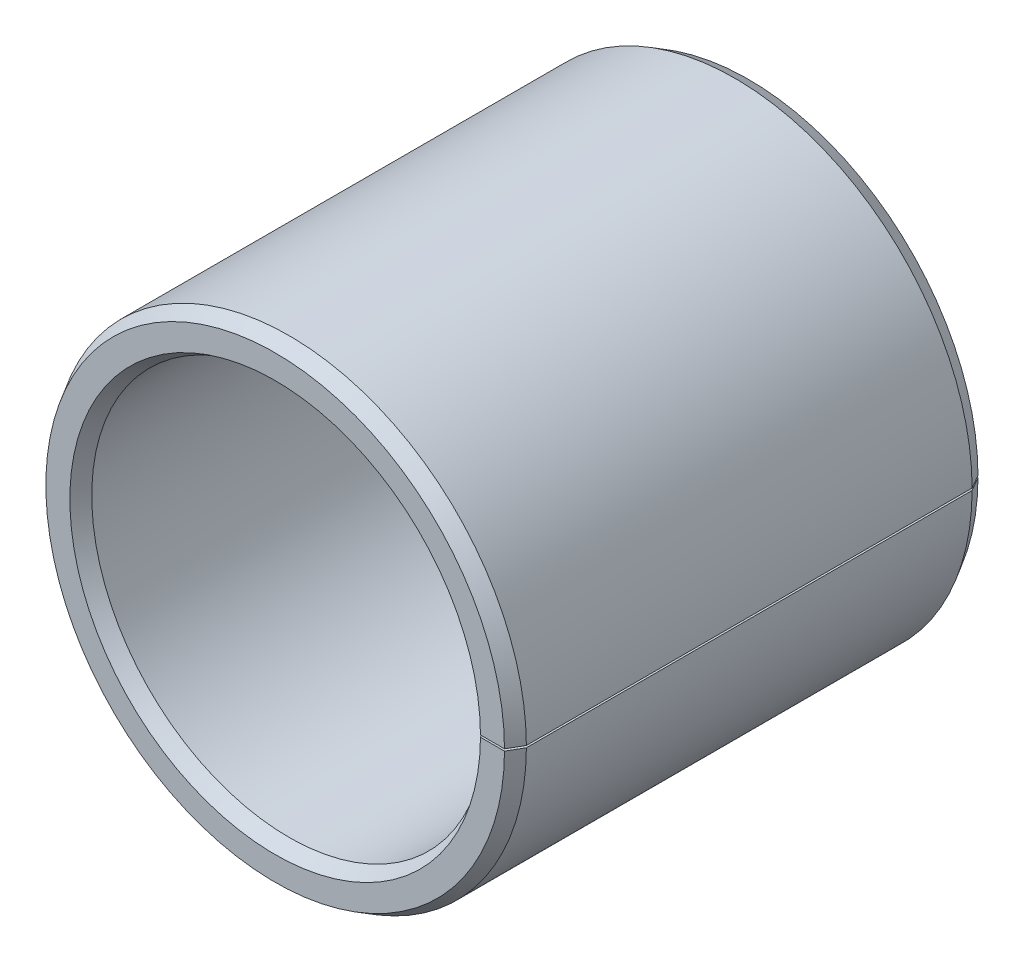
ISO-10303-21;
HEADER;
FILE_DESCRIPTION(('STEP AP214'),'2;1');
FILE_NAME('part.step','',(''),(''),'','','');
FILE_SCHEMA(('AUTOMOTIVE_DESIGN { 1 0 10303 214 1 1 1 1 }'));
ENDSEC;
DATA;
#1=APPLICATION_CONTEXT('core data for automotive mechanical design processes');
#2=APPLICATION_PROTOCOL_DEFINITION('international standard','automotive_design',2000,#1);
#3=PRODUCT_CONTEXT('',#1,'mechanical');
#4=PRODUCT('Part','Part','',(#3));
#5=PRODUCT_RELATED_PRODUCT_CATEGORY('part','',(#4));
#6=PRODUCT_DEFINITION_FORMATION('','',#4);
#7=PRODUCT_DEFINITION_CONTEXT('part definition',#1,'design');
#8=PRODUCT_DEFINITION('design','',#6,#7);
#9=PRODUCT_DEFINITION_SHAPE('','',#8);
#10=(LENGTH_UNIT() NAMED_UNIT(*) SI_UNIT(.MILLI.,.METRE.));
#11=(NAMED_UNIT(*) PLANE_ANGLE_UNIT() SI_UNIT($,.RADIAN.));
#12=(NAMED_UNIT(*) SI_UNIT($,.STERADIAN.) SOLID_ANGLE_UNIT());
#13=UNCERTAINTY_MEASURE_WITH_UNIT(LENGTH_MEASURE(1.E-05),#10,'distance_accuracy_value','');
#14=(GEOMETRIC_REPRESENTATION_CONTEXT(3) GLOBAL_UNCERTAINTY_ASSIGNED_CONTEXT((#13)) GLOBAL_UNIT_ASSIGNED_CONTEXT((#10,
#11,#12)) REPRESENTATION_CONTEXT('',''));
#15=CARTESIAN_POINT('',(0.,0.,0.));
#16=DIRECTION('',(0.,0.,1.));
#17=DIRECTION('',(1.,0.,0.));
#18=AXIS2_PLACEMENT_3D('',#15,#16,#17);
#19=CARTESIAN_POINT('',(0.,0.,5.64839368606353));
#20=DIRECTION('',(0.,0.,1.));
#21=DIRECTION('',(1.,0.,0.));
#22=AXIS2_PLACEMENT_3D('',#19,#20,#21);
#23=PLANE('',#22);
#24=DIRECTION('',(-1.,0.,0.));
#25=VECTOR('',#24,1.);
#26=CARTESIAN_POINT('',(0.,0.025,5.64839368606353));
#27=LINE('',#26,#25);
#28=CARTESIAN_POINT('',(5.20293993815036,0.025,5.64839368606353));
#29=VERTEX_POINT('',#28);
#30=CARTESIAN_POINT('',(4.99993749960938,0.025,5.64839368606353));
#31=VERTEX_POINT('',#30);
#32=EDGE_CURVE('E105',#29,#31,#27,.T.);
#33=ORIENTED_EDGE('',*,*,#32,.F.);
#34=CARTESIAN_POINT('',(0.,0.,5.64839368606353));
#35=DIRECTION('',(0.,0.,1.));
#36=DIRECTION('',(1.,0.,0.));
#37=AXIS2_PLACEMENT_3D('',#34,#35,#36);
#38=CIRCLE('',#37,5.20300000000001);
#39=CARTESIAN_POINT('',(5.20293993815036,-0.025,5.64839368606353));
#40=VERTEX_POINT('',#39);
#41=EDGE_CURVE('E94',#29,#40,#38,.T.);
#42=ORIENTED_EDGE('',*,*,#41,.T.);
#43=DIRECTION('',(1.,0.,0.));
#44=VECTOR('',#43,1.);
#45=CARTESIAN_POINT('',(0.,-0.025,5.64839368606353));
#46=LINE('',#45,#44);
#47=CARTESIAN_POINT('',(4.99993749960938,-0.025,5.64839368606353));
#48=VERTEX_POINT('',#47);
#49=EDGE_CURVE('E117',#48,#40,#46,.T.);
#50=ORIENTED_EDGE('',*,*,#49,.F.);
#51=CARTESIAN_POINT('',(0.,0.,5.64839368606353));
#52=DIRECTION('',(0.,0.,1.));
#53=DIRECTION('',(1.,0.,0.));
#54=AXIS2_PLACEMENT_3D('',#51,#52,#53);
#55=CIRCLE('',#54,5.00000000000001);
#56=EDGE_CURVE('E101',#31,#48,#55,.T.);
#57=ORIENTED_EDGE('',*,*,#56,.F.);
#58=EDGE_LOOP('',(#33,#42,#50,#57));
#59=FACE_BOUND('',#58,.T.);
#60=ADVANCED_FACE('F49',(#59),#23,.T.);
#61=CARTESIAN_POINT('',(0.,0.,5.64839368606353));
#62=DIRECTION('',(0.,0.,-1.));
#63=DIRECTION('',(-1.,0.,0.));
#64=AXIS2_PLACEMENT_3D('',#61,#62,#63);
#65=CYLINDRICAL_SURFACE('',#64,5.20300000000001);
#66=ORIENTED_EDGE('',*,*,#41,.F.);
#67=DIRECTION('',(0.,0.,-1.));
#68=VECTOR('',#67,1.);
#69=CARTESIAN_POINT('',(5.20293993815036,0.025,5.64839368606353));
#70=LINE('',#69,#68);
#71=CARTESIAN_POINT('',(5.20293993815036,0.025,-5.64839368606352));
#72=VERTEX_POINT('',#71);
#73=EDGE_CURVE('E108',#29,#72,#70,.T.);
#74=ORIENTED_EDGE('',*,*,#73,.T.);
#75=CARTESIAN_POINT('',(0.,0.,-5.64839368606352));
#76=DIRECTION('',(0.,0.,1.));
#77=DIRECTION('',(1.,0.,0.));
#78=AXIS2_PLACEMENT_3D('',#75,#76,#77);
#79=CIRCLE('',#78,5.20300000000001);
#80=CARTESIAN_POINT('',(5.20293993815036,-0.025,-5.64839368606352));
#81=VERTEX_POINT('',#80);
#82=EDGE_CURVE('E104',#72,#81,#79,.T.);
#83=ORIENTED_EDGE('',*,*,#82,.T.);
#84=DIRECTION('',(0.,0.,-1.));
#85=VECTOR('',#84,1.);
#86=CARTESIAN_POINT('',(5.20293993815036,-0.025,5.64839368606353));
#87=LINE('',#86,#85);
#88=EDGE_CURVE('E64',#81,#40,#87,.F.);
#89=ORIENTED_EDGE('',*,*,#88,.T.);
#90=EDGE_LOOP('',(#66,#74,#83,#89));
#91=FACE_BOUND('',#90,.T.);
#92=ADVANCED_FACE('F51',(#91),#65,.T.);
#93=CARTESIAN_POINT('',(0.,0.,5.64839368606353));
#94=DIRECTION('',(0.,0.,-1.));
#95=DIRECTION('',(-1.,0.,0.));
#96=AXIS2_PLACEMENT_3D('',#93,#94,#95);
#97=CYLINDRICAL_SURFACE('',#96,5.00000000000001);
#98=DIRECTION('',(0.,0.,-1.));
#99=VECTOR('',#98,1.);
#100=CARTESIAN_POINT('',(4.99993749960938,0.025,5.64839368606353));
#101=LINE('',#100,#99);
#102=CARTESIAN_POINT('',(4.99993749960938,0.025,-5.64839368606352));
#103=VERTEX_POINT('',#102);
#104=EDGE_CURVE('E72',#31,#103,#101,.T.);
#105=ORIENTED_EDGE('',*,*,#104,.F.);
#106=ORIENTED_EDGE('',*,*,#56,.T.);
#107=DIRECTION('',(0.,0.,-1.));
#108=VECTOR('',#107,1.);
#109=CARTESIAN_POINT('',(4.99993749960938,-0.025,5.64839368606353));
#110=LINE('',#109,#108);
#111=CARTESIAN_POINT('',(4.99993749960938,-0.025,-5.64839368606352));
#112=VERTEX_POINT('',#111);
#113=EDGE_CURVE('E88',#112,#48,#110,.F.);
#114=ORIENTED_EDGE('',*,*,#113,.F.);
#115=CARTESIAN_POINT('',(0.,0.,-5.64839368606352));
#116=DIRECTION('',(0.,0.,1.));
#117=DIRECTION('',(1.,0.,0.));
#118=AXIS2_PLACEMENT_3D('',#115,#116,#117);
#119=CIRCLE('',#118,5.00000000000001);
#120=EDGE_CURVE('E99',#103,#112,#119,.T.);
#121=ORIENTED_EDGE('',*,*,#120,.F.);
#122=EDGE_LOOP('',(#105,#106,#114,#121));
#123=FACE_BOUND('',#122,.T.);
#124=ADVANCED_FACE('F98',(#123),#97,.F.);
#125=CARTESIAN_POINT('',(0.,0.,-5.64839368606352));
#126=DIRECTION('',(0.,0.,1.));
#127=DIRECTION('',(1.,0.,0.));
#128=AXIS2_PLACEMENT_3D('',#125,#126,#127);
#129=PLANE('',#128);
#130=ORIENTED_EDGE('',*,*,#82,.F.);
#131=DIRECTION('',(-1.,0.,0.));
#132=VECTOR('',#131,1.);
#133=CARTESIAN_POINT('',(0.,0.025,-5.64839368606352));
#134=LINE('',#133,#132);
#135=EDGE_CURVE('E12',#72,#103,#134,.T.);
#136=ORIENTED_EDGE('',*,*,#135,.T.);
#137=ORIENTED_EDGE('',*,*,#120,.T.);
#138=DIRECTION('',(1.,0.,0.));
#139=VECTOR('',#138,1.);
#140=CARTESIAN_POINT('',(0.,-0.025,-5.64839368606352));
#141=LINE('',#140,#139);
#142=EDGE_CURVE('E57',#112,#81,#141,.T.);
#143=ORIENTED_EDGE('',*,*,#142,.T.);
#144=EDGE_LOOP('',(#130,#136,#137,#143));
#145=FACE_BOUND('',#144,.T.);
#146=ADVANCED_FACE('F103',(#145),#129,.F.);
#147=CARTESIAN_POINT('',(6.015,-0.025,-6.));
#148=DIRECTION('',(0.,-1.,0.));
#149=DIRECTION('',(0.,0.,-1.));
#150=AXIS2_PLACEMENT_3D('',#147,#148,#149);
#151=PLANE('',#150);
#152=ORIENTED_EDGE('',*,*,#49,.T.);
#153=ORIENTED_EDGE('',*,*,#88,.F.);
#154=ORIENTED_EDGE('',*,*,#142,.F.);
#155=ORIENTED_EDGE('',*,*,#113,.T.);
#156=EDGE_LOOP('',(#152,#153,#154,#155));
#157=FACE_BOUND('',#156,.T.);
#158=ADVANCED_FACE('F87',(#157),#151,.F.);
#159=CARTESIAN_POINT('',(0.,0.025,-6.));
#160=DIRECTION('',(0.,1.,0.));
#161=DIRECTION('',(0.,0.,1.));
#162=AXIS2_PLACEMENT_3D('',#159,#160,#161);
#163=PLANE('',#162);
#164=ORIENTED_EDGE('',*,*,#32,.T.);
#165=ORIENTED_EDGE('',*,*,#104,.T.);
#166=ORIENTED_EDGE('',*,*,#135,.F.);
#167=ORIENTED_EDGE('',*,*,#73,.F.);
#168=EDGE_LOOP('',(#164,#165,#166,#167));
#169=FACE_BOUND('',#168,.T.);
#170=ADVANCED_FACE('F123',(#169),#163,.F.);
#171=CLOSED_SHELL('',(#60,#92,#124,#146,#158,#170));
#172=MANIFOLD_SOLID_BREP('B2',#171);
#173=CARTESIAN_POINT('',(0.,0.,6.));
#174=DIRECTION('',(0.,0.,1.));
#175=DIRECTION('',(0.,-1.,0.));
#176=AXIS2_PLACEMENT_3D('',#173,#174,#175);
#177=CYLINDRICAL_SURFACE('',#176,6.015);
#178=CARTESIAN_POINT('',(0.,0.,5.64839368606353));
#179=DIRECTION('',(0.,0.,-1.));
#180=DIRECTION('',(0.,1.,0.));
#181=AXIS2_PLACEMENT_3D('',#178,#179,#180);
#182=CIRCLE('',#181,6.015);
#183=CARTESIAN_POINT('',(6.01494804632592,-0.025,5.64839368606353));
#184=VERTEX_POINT('',#183);
#185=CARTESIAN_POINT('',(6.01494804632592,0.025,5.64839368606353));
#186=VERTEX_POINT('',#185);
#187=EDGE_CURVE('E275',#184,#186,#182,.T.);
#188=ORIENTED_EDGE('',*,*,#187,.T.);
#189=DIRECTION('',(0.,0.,1.));
#190=VECTOR('',#189,1.);
#191=CARTESIAN_POINT('',(6.01494804632592,0.025,6.));
#192=LINE('',#191,#190);
#193=CARTESIAN_POINT('',(6.01494804632592,0.0250000000000021,-5.64839368606352));
#194=VERTEX_POINT('',#193);
#195=EDGE_CURVE('E292',#186,#194,#192,.F.);
#196=ORIENTED_EDGE('',*,*,#195,.T.);
#197=CARTESIAN_POINT('',(0.,0.,-5.64839368606352));
#198=DIRECTION('',(0.,0.,1.));
#199=DIRECTION('',(0.,-1.,0.));
#200=AXIS2_PLACEMENT_3D('',#197,#198,#199);
#201=CIRCLE('',#200,6.015);
#202=CARTESIAN_POINT('',(6.01494804632592,-0.0249999999999979,-5.64839368606352));
#203=VERTEX_POINT('',#202);
#204=EDGE_CURVE('E259',#194,#203,#201,.T.);
#205=ORIENTED_EDGE('',*,*,#204,.T.);
#206=DIRECTION('',(0.,0.,1.));
#207=VECTOR('',#206,1.);
#208=CARTESIAN_POINT('',(6.01494804632592,-0.025,6.));
#209=LINE('',#208,#207);
#210=EDGE_CURVE('E351',#203,#184,#209,.T.);
#211=ORIENTED_EDGE('',*,*,#210,.T.);
#212=EDGE_LOOP('',(#188,#196,#205,#211));
#213=FACE_BOUND('',#212,.T.);
#214=ADVANCED_FACE('F161',(#213),#177,.T.);
#215=CARTESIAN_POINT('',(0.,6.015,6.));
#216=DIRECTION('',(0.,0.,-1.));
#217=DIRECTION('',(0.,1.,0.));
#218=AXIS2_PLACEMENT_3D('',#215,#216,#217);
#219=PLANE('',#218);
#220=CARTESIAN_POINT('',(0.,0.,6.));
#221=DIRECTION('',(0.,0.,-1.));
#222=DIRECTION('',(0.,1.,0.));
#223=AXIS2_PLACEMENT_3D('',#220,#221,#222);
#224=CIRCLE('',#223,5.20300000000001);
#225=CARTESIAN_POINT('',(5.20293993815036,-0.025,6.));
#226=VERTEX_POINT('',#225);
#227=CARTESIAN_POINT('',(5.20293993815036,0.025,6.));
#228=VERTEX_POINT('',#227);
#229=EDGE_CURVE('E252',#226,#228,#224,.T.);
#230=ORIENTED_EDGE('',*,*,#229,.T.);
#231=DIRECTION('',(-1.,0.,0.));
#232=VECTOR('',#231,1.);
#233=CARTESIAN_POINT('',(0.,0.025,6.));
#234=LINE('',#233,#232);
#235=CARTESIAN_POINT('',(5.81194623168522,0.025,6.));
#236=VERTEX_POINT('',#235);
#237=EDGE_CURVE('E256',#236,#228,#234,.T.);
#238=ORIENTED_EDGE('',*,*,#237,.F.);
#239=CARTESIAN_POINT('',(0.,0.,6.));
#240=DIRECTION('',(0.,0.,-1.));
#241=DIRECTION('',(0.,1.,0.));
#242=AXIS2_PLACEMENT_3D('',#239,#240,#241);
#243=CIRCLE('',#242,5.812);
#244=CARTESIAN_POINT('',(5.81194623168522,-0.025,6.));
#245=VERTEX_POINT('',#244);
#246=EDGE_CURVE('E254',#236,#245,#243,.F.);
#247=ORIENTED_EDGE('',*,*,#246,.T.);
#248=DIRECTION('',(1.,0.,0.));
#249=VECTOR('',#248,1.);
#250=CARTESIAN_POINT('',(6.015,-0.025,6.));
#251=LINE('',#250,#249);
#252=EDGE_CURVE('E239',#226,#245,#251,.T.);
#253=ORIENTED_EDGE('',*,*,#252,.F.);
#254=EDGE_LOOP('',(#230,#238,#247,#253));
#255=FACE_BOUND('',#254,.T.);
#256=ADVANCED_FACE('F250',(#255),#219,.F.);
#257=CARTESIAN_POINT('',(0.,5.,-6.));
#258=DIRECTION('',(0.,0.,1.));
#259=DIRECTION('',(0.,-1.,0.));
#260=AXIS2_PLACEMENT_3D('',#257,#258,#259);
#261=PLANE('',#260);
#262=CARTESIAN_POINT('',(0.,0.,-6.));
#263=DIRECTION('',(0.,0.,1.));
#264=DIRECTION('',(0.,-1.,0.));
#265=AXIS2_PLACEMENT_3D('',#262,#263,#264);
#266=CIRCLE('',#265,5.812);
#267=CARTESIAN_POINT('',(5.81194623168522,-0.025,-6.));
#268=VERTEX_POINT('',#267);
#269=CARTESIAN_POINT('',(5.81194623168522,0.025,-6.));
#270=VERTEX_POINT('',#269);
#271=EDGE_CURVE('E263',#268,#270,#266,.F.);
#272=ORIENTED_EDGE('',*,*,#271,.T.);
#273=DIRECTION('',(-1.,0.,0.));
#274=VECTOR('',#273,1.);
#275=CARTESIAN_POINT('',(0.,0.025,-6.));
#276=LINE('',#275,#274);
#277=CARTESIAN_POINT('',(5.20293993815036,0.025,-6.));
#278=VERTEX_POINT('',#277);
#279=EDGE_CURVE('E255',#270,#278,#276,.T.);
#280=ORIENTED_EDGE('',*,*,#279,.T.);
#281=CARTESIAN_POINT('',(0.,0.,-6.));
#282=DIRECTION('',(0.,0.,1.));
#283=DIRECTION('',(0.,-1.,0.));
#284=AXIS2_PLACEMENT_3D('',#281,#282,#283);
#285=CIRCLE('',#284,5.203);
#286=CARTESIAN_POINT('',(5.20293993815036,-0.025,-6.));
#287=VERTEX_POINT('',#286);
#288=EDGE_CURVE('E271',#278,#287,#285,.T.);
#289=ORIENTED_EDGE('',*,*,#288,.T.);
#290=DIRECTION('',(1.,0.,0.));
#291=VECTOR('',#290,1.);
#292=CARTESIAN_POINT('',(6.015,-0.025,-6.));
#293=LINE('',#292,#291);
#294=EDGE_CURVE('E390',#287,#268,#293,.T.);
#295=ORIENTED_EDGE('',*,*,#294,.T.);
#296=EDGE_LOOP('',(#272,#280,#289,#295));
#297=FACE_BOUND('',#296,.T.);
#298=ADVANCED_FACE('F361',(#297),#261,.F.);
#299=CARTESIAN_POINT('',(0.,0.,5.64839368606351));
#300=DIRECTION('',(0.,0.,1.));
#301=DIRECTION('',(0.,-1.,0.));
#302=AXIS2_PLACEMENT_3D('',#299,#300,#301);
#303=CONICAL_SURFACE('',#302,5.,0.523598775598299);
#304=CARTESIAN_POINT('',(8.27378166634671,0.025,11.3188152843196));
#305=CARTESIAN_POINT('',(7.17061119781088,0.025,9.40805344412511));
#306=CARTESIAN_POINT('',(6.06742813863086,0.025,7.49729887330834));
#307=CARTESIAN_POINT('',(3.86103683891854,0.025,3.67580427031968));
#308=CARTESIAN_POINT('',(2.75782859838625,0.025,1.76506423814778));
#309=CARTESIAN_POINT('',(1.65460776720976,0.025,-0.14566852464637));
#310=B_SPLINE_CURVE_WITH_KNOTS('',3,(#304,#305,#306,#307,#308,#309),.UNSPECIFIED.,.F.,.F.,(4,2,
4),(0.,6.61906058497961,13.2381211703424),.UNSPECIFIED.);
#311=CARTESIAN_POINT('',(4.99993749960938,0.025,5.64839368606353));
#312=VERTEX_POINT('',#311);
#313=EDGE_CURVE('E185',#228,#312,#310,.T.);
#314=ORIENTED_EDGE('',*,*,#313,.F.);
#315=ORIENTED_EDGE('',*,*,#229,.F.);
#316=CARTESIAN_POINT('',(1.65460776720976,-0.025,-0.14566852464637));
#317=CARTESIAN_POINT('',(2.02236511237594,-0.025,0.491248695610512));
#318=CARTESIAN_POINT('',(2.39011602194577,-0.025,1.12816963164013));
#319=CARTESIAN_POINT('',(3.49333349520232,-0.025,3.03890433306759));
#320=CARTESIAN_POINT('',(4.22878578986687,-0.025,4.31272633707269));
#321=CARTESIAN_POINT('',(6.06741302942579,-0.025,7.49730759702126));
#322=CARTESIAN_POINT('',(7.1705809794247,-0.025,9.40807089159242));
#323=CARTESIAN_POINT('',(8.27378166634671,-0.025,11.3188152843196));
#324=B_SPLINE_CURVE_WITH_KNOTS('',3,(#316,#317,#318,#319,#320,#321,#322,#323),.UNSPECIFIED.,.F.,
.F.,(4,2,2,4),(0.,2.20639549769148,6.61906058565023,13.2381211706298),.UNSPECIFIED.);
#325=CARTESIAN_POINT('',(4.99993749960938,-0.025,5.64839368606353));
#326=VERTEX_POINT('',#325);
#327=EDGE_CURVE('E236',#326,#226,#324,.T.);
#328=ORIENTED_EDGE('',*,*,#327,.F.);
#329=CARTESIAN_POINT('',(0.,0.,5.64839368606353));
#330=DIRECTION('',(0.,0.,1.));
#331=DIRECTION('',(1.,0.,0.));
#332=AXIS2_PLACEMENT_3D('',#329,#330,#331);
#333=CIRCLE('',#332,5.00000000000001);
#334=EDGE_CURVE('E260',#312,#326,#333,.T.);
#335=ORIENTED_EDGE('',*,*,#334,.F.);
#336=EDGE_LOOP('',(#314,#315,#328,#335));
#337=FACE_BOUND('',#336,.T.);
#338=ADVANCED_FACE('F258',(#337),#303,.F.);
#339=CARTESIAN_POINT('',(0.,0.,-5.64839368606352));
#340=DIRECTION('',(0.,0.,1.));
#341=DIRECTION('',(0.,-1.,0.));
#342=AXIS2_PLACEMENT_3D('',#339,#340,#341);
#343=CONICAL_SURFACE('',#342,6.015,0.523598775598299);
#344=CARTESIAN_POINT('',(1.91683696936093,0.025,-12.7463379103397));
#345=CARTESIAN_POINT('',(2.34285834223249,0.025,-12.008496610589));
#346=CARTESIAN_POINT('',(2.76887415994896,0.025,-11.2706521034525));
#347=CARTESIAN_POINT('',(4.04689118078146,0.025,-9.05714284406147));
#348=CARTESIAN_POINT('',(4.89888006672524,0.025,-7.58147098023761));
#349=CARTESIAN_POINT('',(7.02884926280297,0.025,-3.89226866160568));
#350=CARTESIAN_POINT('',(8.30682353492939,0.025,-1.67873472067326));
#351=CARTESIAN_POINT('',(9.58482606545364,0.025,0.534782904511334));
#352=B_SPLINE_CURVE_WITH_KNOTS('',3,(#344,#345,#346,#347,#348,#349,#350,#351),.UNSPECIFIED.,.F.,
.F.,(4,2,2,4),(0.,2.55599998883889,7.66789128282732,15.3357825652233),.UNSPECIFIED.);
#353=EDGE_CURVE('E289',#270,#194,#352,.T.);
#354=ORIENTED_EDGE('',*,*,#353,.F.);
#355=ORIENTED_EDGE('',*,*,#271,.F.);
#356=CARTESIAN_POINT('',(9.58482606545364,-0.025,0.534782904511334));
#357=CARTESIAN_POINT('',(8.30684961940359,-0.025,-1.67874978111357));
#358=CARTESIAN_POINT('',(7.02886230504778,-0.025,-3.89227619181249));
#359=CARTESIAN_POINT('',(4.47286593968354,-0.025,-8.31931646342952));
#360=CARTESIAN_POINT('',(3.19485688867512,-0.025,-10.5328303243476));
#361=CARTESIAN_POINT('',(1.91683696936093,-0.025,-12.7463379103397));
#362=B_SPLINE_CURVE_WITH_KNOTS('',3,(#356,#357,#358,#359,#360,#361),.UNSPECIFIED.,.F.,.F.,(4,2,
4),(0.,7.66789128239598,15.3357825650384),.UNSPECIFIED.);
#363=EDGE_CURVE('E345',#203,#268,#362,.T.);
#364=ORIENTED_EDGE('',*,*,#363,.F.);
#365=ORIENTED_EDGE('',*,*,#204,.F.);
#366=EDGE_LOOP('',(#354,#355,#364,#365));
#367=FACE_BOUND('',#366,.T.);
#368=ADVANCED_FACE('F353',(#367),#343,.T.);
#369=CARTESIAN_POINT('',(0.,0.,-6.));
#370=DIRECTION('',(0.,0.,-1.));
#371=DIRECTION('',(0.,1.,0.));
#372=AXIS2_PLACEMENT_3D('',#369,#370,#371);
#373=CONICAL_SURFACE('',#372,5.203,0.523598775598299);
#374=CARTESIAN_POINT('',(1.65460776720976,0.025,0.145668524646367));
#375=CARTESIAN_POINT('',(2.02236511237594,0.025,-0.491248695610515));
#376=CARTESIAN_POINT('',(2.39011602194577,0.025,-1.12816963164014));
#377=CARTESIAN_POINT('',(3.49333349520232,0.025,-3.0389043330676));
#378=CARTESIAN_POINT('',(4.22878578986686,0.025,-4.3127263370727));
#379=CARTESIAN_POINT('',(6.06741302942579,0.025,-7.49730759702126));
#380=CARTESIAN_POINT('',(7.17058097942469,0.025,-9.40807089159242));
#381=CARTESIAN_POINT('',(8.2737816663467,0.025,-11.3188152843196));
#382=B_SPLINE_CURVE_WITH_KNOTS('',3,(#374,#375,#376,#377,#378,#379,#380,#381),.UNSPECIFIED.,.F.,
.F.,(4,2,2,4),(0.,2.20639549769148,6.61906058565023,13.2381211706298),.UNSPECIFIED.);
#383=CARTESIAN_POINT('',(4.99993749960937,0.025,-5.64839368606352));
#384=VERTEX_POINT('',#383);
#385=EDGE_CURVE('E309',#384,#278,#382,.T.);
#386=ORIENTED_EDGE('',*,*,#385,.F.);
#387=CARTESIAN_POINT('',(0.,0.,-5.64839368606352));
#388=DIRECTION('',(0.,0.,1.));
#389=DIRECTION('',(1.,0.,0.));
#390=AXIS2_PLACEMENT_3D('',#387,#388,#389);
#391=CIRCLE('',#390,5.);
#392=CARTESIAN_POINT('',(4.99993749960937,-0.025,-5.64839368606352));
#393=VERTEX_POINT('',#392);
#394=EDGE_CURVE('E265',#384,#393,#391,.T.);
#395=ORIENTED_EDGE('',*,*,#394,.T.);
#396=CARTESIAN_POINT('',(8.2737816663467,-0.025,-11.3188152843196));
#397=CARTESIAN_POINT('',(7.17061119781088,-0.025,-9.40805344412511));
#398=CARTESIAN_POINT('',(6.06742813863085,-0.025,-7.49729887330835));
#399=CARTESIAN_POINT('',(3.86103683891854,-0.025,-3.67580427031968));
#400=CARTESIAN_POINT('',(2.75782859838625,-0.025,-1.76506423814779));
#401=CARTESIAN_POINT('',(1.65460776720976,-0.025,0.145668524646367));
#402=B_SPLINE_CURVE_WITH_KNOTS('',3,(#396,#397,#398,#399,#400,#401),.UNSPECIFIED.,.F.,.F.,(4,2,
4),(0.,6.61906058497961,13.2381211703424),.UNSPECIFIED.);
#403=EDGE_CURVE('E308',#287,#393,#402,.T.);
#404=ORIENTED_EDGE('',*,*,#403,.F.);
#405=ORIENTED_EDGE('',*,*,#288,.F.);
#406=EDGE_LOOP('',(#386,#395,#404,#405));
#407=FACE_BOUND('',#406,.T.);
#408=ADVANCED_FACE('F306',(#407),#373,.F.);
#409=CARTESIAN_POINT('',(0.,0.,6.));
#410=DIRECTION('',(0.,0.,-1.));
#411=DIRECTION('',(0.,1.,0.));
#412=AXIS2_PLACEMENT_3D('',#409,#410,#411);
#413=CONICAL_SURFACE('',#412,5.812,0.523598775598304);
#414=CARTESIAN_POINT('',(9.58482606545366,0.025,-0.534782904511287));
#415=CARTESIAN_POINT('',(8.3068496194036,0.025,1.6787497811136));
#416=CARTESIAN_POINT('',(7.02886230504778,0.025,3.89227619181251));
#417=CARTESIAN_POINT('',(4.47286593968353,0.025,8.31931646342951));
#418=CARTESIAN_POINT('',(3.1948568886751,0.025,10.5328303243476));
#419=CARTESIAN_POINT('',(1.9168369693609,0.025,12.7463379103397));
#420=B_SPLINE_CURVE_WITH_KNOTS('',3,(#414,#415,#416,#417,#418,#419),.UNSPECIFIED.,.F.,.F.,(4,2,
4),(0.,7.66789128239595,15.3357825650384),.UNSPECIFIED.);
#421=EDGE_CURVE('E375',#186,#236,#420,.T.);
#422=ORIENTED_EDGE('',*,*,#421,.F.);
#423=ORIENTED_EDGE('',*,*,#187,.F.);
#424=CARTESIAN_POINT('',(1.9168369693609,-0.025,12.7463379103397));
#425=CARTESIAN_POINT('',(2.34285834223246,-0.025,12.0084966105889));
#426=CARTESIAN_POINT('',(2.76887415994893,-0.025,11.2706521034524));
#427=CARTESIAN_POINT('',(4.04689118078144,-0.025,9.05714284406147));
#428=CARTESIAN_POINT('',(4.89888006672522,-0.025,7.58147098023761));
#429=CARTESIAN_POINT('',(7.02884926280298,-0.025,3.8922686616057));
#430=CARTESIAN_POINT('',(8.3068235349294,-0.025,1.67873472067331));
#431=CARTESIAN_POINT('',(9.58482606545366,-0.025,-0.534782904511287));
#432=B_SPLINE_CURVE_WITH_KNOTS('',3,(#424,#425,#426,#427,#428,#429,#430,#431),.UNSPECIFIED.,.F.,
.F.,(4,2,2,4),(0.,2.55599998883886,7.6678912828273,15.3357825652232),.UNSPECIFIED.);
#433=EDGE_CURVE('E316',#245,#184,#432,.T.);
#434=ORIENTED_EDGE('',*,*,#433,.F.);
#435=ORIENTED_EDGE('',*,*,#246,.F.);
#436=EDGE_LOOP('',(#422,#423,#434,#435));
#437=FACE_BOUND('',#436,.T.);
#438=ADVANCED_FACE('F163',(#437),#413,.T.);
#439=CARTESIAN_POINT('',(0.,0.,-5.64839368606352));
#440=DIRECTION('',(0.,0.,1.));
#441=DIRECTION('',(1.,0.,0.));
#442=AXIS2_PLACEMENT_3D('',#439,#440,#441);
#443=CYLINDRICAL_SURFACE('',#442,5.20300000000001);
#444=CARTESIAN_POINT('',(0.,0.,-5.64839368606352));
#445=DIRECTION('',(0.,0.,1.));
#446=DIRECTION('',(1.,0.,0.));
#447=AXIS2_PLACEMENT_3D('',#444,#445,#446);
#448=CIRCLE('',#447,5.20300000000001);
#449=CARTESIAN_POINT('',(5.20293993815036,0.025,-5.64839368606352));
#450=VERTEX_POINT('',#449);
#451=CARTESIAN_POINT('',(5.20293993815036,-0.025,-5.64839368606352));
#452=VERTEX_POINT('',#451);
#453=EDGE_CURVE('E288',#450,#452,#448,.T.);
#454=ORIENTED_EDGE('',*,*,#453,.F.);
#455=DIRECTION('',(0.,0.,1.));
#456=VECTOR('',#455,1.);
#457=CARTESIAN_POINT('',(5.20293993815036,0.025,-5.64839368606352));
#458=LINE('',#457,#456);
#459=CARTESIAN_POINT('',(5.20293993815036,0.025,5.64839368606353));
#460=VERTEX_POINT('',#459);
#461=EDGE_CURVE('E287',#450,#460,#458,.T.);
#462=ORIENTED_EDGE('',*,*,#461,.T.);
#463=CARTESIAN_POINT('',(0.,0.,5.64839368606353));
#464=DIRECTION('',(0.,0.,1.));
#465=DIRECTION('',(1.,0.,0.));
#466=AXIS2_PLACEMENT_3D('',#463,#464,#465);
#467=CIRCLE('',#466,5.20300000000001);
#468=CARTESIAN_POINT('',(5.20293993815036,-0.025,5.64839368606353));
#469=VERTEX_POINT('',#468);
#470=EDGE_CURVE('E281',#460,#469,#467,.T.);
#471=ORIENTED_EDGE('',*,*,#470,.T.);
#472=DIRECTION('',(0.,0.,1.));
#473=VECTOR('',#472,1.);
#474=CARTESIAN_POINT('',(5.20293993815036,-0.025,-5.64839368606352));
#475=LINE('',#474,#473);
#476=EDGE_CURVE('E177',#469,#452,#475,.F.);
#477=ORIENTED_EDGE('',*,*,#476,.T.);
#478=EDGE_LOOP('',(#454,#462,#471,#477));
#479=FACE_BOUND('',#478,.T.);
#480=ADVANCED_FACE('F285',(#479),#443,.F.);
#481=CARTESIAN_POINT('',(0.,0.,-5.64839368606352));
#482=DIRECTION('',(0.,0.,1.));
#483=DIRECTION('',(1.,0.,0.));
#484=AXIS2_PLACEMENT_3D('',#481,#482,#483);
#485=PLANE('',#484);
#486=DIRECTION('',(-1.,0.,0.));
#487=VECTOR('',#486,1.);
#488=CARTESIAN_POINT('',(0.,0.025,-5.64839368606352));
#489=LINE('',#488,#487);
#490=EDGE_CURVE('E314',#450,#384,#489,.T.);
#491=ORIENTED_EDGE('',*,*,#490,.F.);
#492=ORIENTED_EDGE('',*,*,#453,.T.);
#493=DIRECTION('',(1.,0.,0.));
#494=VECTOR('',#493,1.);
#495=CARTESIAN_POINT('',(0.,-0.025,-5.64839368606352));
#496=LINE('',#495,#494);
#497=EDGE_CURVE('E245',#393,#452,#496,.T.);
#498=ORIENTED_EDGE('',*,*,#497,.F.);
#499=ORIENTED_EDGE('',*,*,#394,.F.);
#500=EDGE_LOOP('',(#491,#492,#498,#499));
#501=FACE_BOUND('',#500,.T.);
#502=ADVANCED_FACE('F313',(#501),#485,.T.);
#503=CARTESIAN_POINT('',(0.,0.,5.64839368606353));
#504=DIRECTION('',(0.,0.,1.));
#505=DIRECTION('',(1.,0.,0.));
#506=AXIS2_PLACEMENT_3D('',#503,#504,#505);
#507=PLANE('',#506);
#508=ORIENTED_EDGE('',*,*,#470,.F.);
#509=DIRECTION('',(-1.,0.,0.));
#510=VECTOR('',#509,1.);
#511=CARTESIAN_POINT('',(0.,0.025,5.64839368606353));
#512=LINE('',#511,#510);
#513=EDGE_CURVE('E47',#460,#312,#512,.T.);
#514=ORIENTED_EDGE('',*,*,#513,.T.);
#515=ORIENTED_EDGE('',*,*,#334,.T.);
#516=DIRECTION('',(1.,0.,0.));
#517=VECTOR('',#516,1.);
#518=CARTESIAN_POINT('',(0.,-0.025,5.64839368606353));
#519=LINE('',#518,#517);
#520=EDGE_CURVE('E170',#326,#469,#519,.T.);
#521=ORIENTED_EDGE('',*,*,#520,.T.);
#522=EDGE_LOOP('',(#508,#514,#515,#521));
#523=FACE_BOUND('',#522,.T.);
#524=ADVANCED_FACE('F280',(#523),#507,.F.);
#525=CARTESIAN_POINT('',(6.015,-0.025,-6.));
#526=DIRECTION('',(0.,-1.,0.));
#527=DIRECTION('',(0.,0.,-1.));
#528=AXIS2_PLACEMENT_3D('',#525,#526,#527);
#529=PLANE('',#528);
#530=ORIENTED_EDGE('',*,*,#363,.T.);
#531=ORIENTED_EDGE('',*,*,#294,.F.);
#532=ORIENTED_EDGE('',*,*,#403,.T.);
#533=ORIENTED_EDGE('',*,*,#497,.T.);
#534=ORIENTED_EDGE('',*,*,#476,.F.);
#535=ORIENTED_EDGE('',*,*,#520,.F.);
#536=ORIENTED_EDGE('',*,*,#327,.T.);
#537=ORIENTED_EDGE('',*,*,#252,.T.);
#538=ORIENTED_EDGE('',*,*,#433,.T.);
#539=ORIENTED_EDGE('',*,*,#210,.F.);
#540=EDGE_LOOP('',(#530,#531,#532,#533,#534,#535,#536,#537,#538,#539));
#541=FACE_BOUND('',#540,.T.);
#542=ADVANCED_FACE('F238',(#541),#529,.F.);
#543=CARTESIAN_POINT('',(0.,0.025,-6.));
#544=DIRECTION('',(0.,1.,0.));
#545=DIRECTION('',(0.,0.,1.));
#546=AXIS2_PLACEMENT_3D('',#543,#544,#545);
#547=PLANE('',#546);
#548=ORIENTED_EDGE('',*,*,#353,.T.);
#549=ORIENTED_EDGE('',*,*,#195,.F.);
#550=ORIENTED_EDGE('',*,*,#421,.T.);
#551=ORIENTED_EDGE('',*,*,#237,.T.);
#552=ORIENTED_EDGE('',*,*,#313,.T.);
#553=ORIENTED_EDGE('',*,*,#513,.F.);
#554=ORIENTED_EDGE('',*,*,#461,.F.);
#555=ORIENTED_EDGE('',*,*,#490,.T.);
#556=ORIENTED_EDGE('',*,*,#385,.T.);
#557=ORIENTED_EDGE('',*,*,#279,.F.);
#558=EDGE_LOOP('',(#548,#549,#550,#551,#552,#553,#554,#555,#556,#557));
#559=FACE_BOUND('',#558,.T.);
#560=ADVANCED_FACE('F338',(#559),#547,.F.);
#561=CLOSED_SHELL('',(#214,#256,#298,#338,#368,#408,#438,#480,#502,#524,#542,#560));
#562=MANIFOLD_SOLID_BREP('B6',#561);
#563=ADVANCED_BREP_SHAPE_REPRESENTATION('',(#18,#172,#562),#14);
#564=SHAPE_DEFINITION_REPRESENTATION(#9,#563);
ENDSEC;
END-ISO-10303-21;
